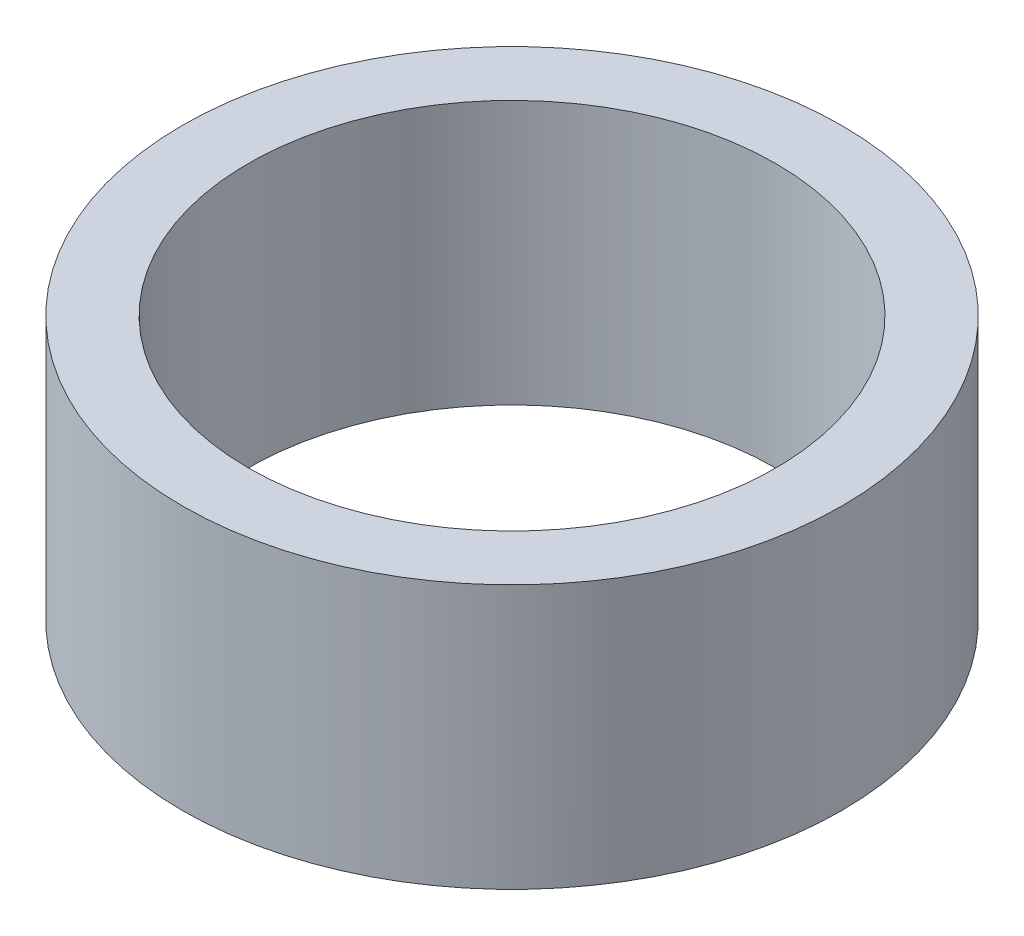
ISO-10303-21;
HEADER;
FILE_DESCRIPTION(('STEP AP214'),'2;1');
FILE_NAME('part.step','',(''),(''),'','','');
FILE_SCHEMA(('AUTOMOTIVE_DESIGN { 1 0 10303 214 1 1 1 1 }'));
ENDSEC;
DATA;
#1=APPLICATION_CONTEXT('core data for automotive mechanical design processes');
#2=APPLICATION_PROTOCOL_DEFINITION('international standard','automotive_design',2000,#1);
#3=PRODUCT_CONTEXT('',#1,'mechanical');
#4=PRODUCT('Part','Part','',(#3));
#5=PRODUCT_RELATED_PRODUCT_CATEGORY('part','',(#4));
#6=PRODUCT_DEFINITION_FORMATION('','',#4);
#7=PRODUCT_DEFINITION_CONTEXT('part definition',#1,'design');
#8=PRODUCT_DEFINITION('design','',#6,#7);
#9=PRODUCT_DEFINITION_SHAPE('','',#8);
#10=(LENGTH_UNIT() NAMED_UNIT(*) SI_UNIT(.MILLI.,.METRE.));
#11=(NAMED_UNIT(*) PLANE_ANGLE_UNIT() SI_UNIT($,.RADIAN.));
#12=(NAMED_UNIT(*) SI_UNIT($,.STERADIAN.) SOLID_ANGLE_UNIT());
#13=UNCERTAINTY_MEASURE_WITH_UNIT(LENGTH_MEASURE(1.E-05),#10,'distance_accuracy_value','');
#14=(GEOMETRIC_REPRESENTATION_CONTEXT(3) GLOBAL_UNCERTAINTY_ASSIGNED_CONTEXT((#13)) GLOBAL_UNIT_ASSIGNED_CONTEXT((#10,
#11,#12)) REPRESENTATION_CONTEXT('',''));
#15=CARTESIAN_POINT('',(0.,0.,0.));
#16=DIRECTION('',(0.,0.,1.));
#17=DIRECTION('',(1.,0.,0.));
#18=AXIS2_PLACEMENT_3D('',#15,#16,#17);
#19=CARTESIAN_POINT('',(2143.78269268001,591.547942348001,668.994154800002));
#20=DIRECTION('',(0.00012941094163007,0.999999972257219,-0.000196820653176026));
#21=DIRECTION('',(0.,0.000196820654824122,0.999999980630815));
#22=AXIS2_PLACEMENT_3D('',#19,#20,#21);
#23=CYLINDRICAL_SURFACE('',#22,4.99999999999984);
#24=CARTESIAN_POINT('',(2143.78269268001,591.547942348001,668.994154800002));
#25=DIRECTION('',(0.00012941094163007,0.999999972257219,-0.000196820653176026));
#26=DIRECTION('',(0.,-0.000196820654824123,-0.999999980630815));
#27=AXIS2_PLACEMENT_3D('',#24,#25,#26);
#28=CIRCLE('',#27,4.99999999999984);
#29=CARTESIAN_POINT('',(2143.78269268001,591.546958244727,663.994154896848));
#30=VERTEX_POINT('',#29);
#31=EDGE_CURVE('E10',#30,#30,#28,.T.);
#32=ORIENTED_EDGE('',*,*,#31,.T.);
#33=EDGE_LOOP('',(#32));
#34=FACE_BOUND('',#33,.T.);
#35=CARTESIAN_POINT('',(2143.78321032378,595.547942236999,668.993367517389));
#36=DIRECTION('',(0.00012941094163007,0.999999972257219,-0.000196820653176026));
#37=DIRECTION('',(0.,-0.000196820654824123,-0.999999980630815));
#38=AXIS2_PLACEMENT_3D('',#35,#36,#37);
#39=CIRCLE('',#38,4.99999999999984);
#40=CARTESIAN_POINT('',(2143.78321032378,595.546958133725,663.993367614235));
#41=VERTEX_POINT('',#40);
#42=EDGE_CURVE('E37',#41,#41,#39,.T.);
#43=ORIENTED_EDGE('',*,*,#42,.F.);
#44=EDGE_LOOP('',(#43));
#45=FACE_BOUND('',#44,.T.);
#46=ADVANCED_FACE('F31',(#34,#45),#23,.T.);
#47=CARTESIAN_POINT('',(2143.78269268001,591.547942348001,668.994154800002));
#48=DIRECTION('',(-0.00012941094163007,-0.999999972257219,0.000196820653176026));
#49=DIRECTION('',(0.,-0.000196820654824123,-0.999999980630815));
#50=AXIS2_PLACEMENT_3D('',#47,#48,#49);
#51=PLANE('',#50);
#52=CARTESIAN_POINT('',(2143.78269268001,591.547942348001,668.994154800002));
#53=DIRECTION('',(0.00012941094163007,0.999999972257219,-0.000196820653176026));
#54=DIRECTION('',(0.,-0.000196820654824123,-0.999999980630815));
#55=AXIS2_PLACEMENT_3D('',#52,#53,#54);
#56=CIRCLE('',#55,3.99999999999983);
#57=CARTESIAN_POINT('',(2143.78269268001,591.547155065382,664.994154877479));
#58=VERTEX_POINT('',#57);
#59=EDGE_CURVE('E41',#58,#58,#56,.T.);
#60=ORIENTED_EDGE('',*,*,#59,.T.);
#61=EDGE_LOOP('',(#60));
#62=FACE_BOUND('',#61,.T.);
#63=ORIENTED_EDGE('',*,*,#31,.F.);
#64=EDGE_LOOP('',(#63));
#65=FACE_BOUND('',#64,.T.);
#66=ADVANCED_FACE('F55',(#62,#65),#51,.T.);
#67=CARTESIAN_POINT('',(2143.78321032378,595.547942236999,668.993367517389));
#68=DIRECTION('',(-0.00012941094163007,-0.999999972257219,0.000196820653176026));
#69=DIRECTION('',(0.,-0.000196820654824123,-0.999999980630815));
#70=AXIS2_PLACEMENT_3D('',#67,#68,#69);
#71=PLANE('',#70);
#72=CARTESIAN_POINT('',(2143.78321032378,595.547942236999,668.993367517389));
#73=DIRECTION('',(0.00012941094163007,0.999999972257219,-0.000196820653176026));
#74=DIRECTION('',(0.,-0.000196820654824123,-0.999999980630815));
#75=AXIS2_PLACEMENT_3D('',#72,#73,#74);
#76=CIRCLE('',#75,3.99999999999983);
#77=CARTESIAN_POINT('',(2143.78321032378,595.54715495438,664.993367594866));
#78=VERTEX_POINT('',#77);
#79=EDGE_CURVE('E45',#78,#78,#76,.T.);
#80=ORIENTED_EDGE('',*,*,#79,.F.);
#81=EDGE_LOOP('',(#80));
#82=FACE_BOUND('',#81,.T.);
#83=ORIENTED_EDGE('',*,*,#42,.T.);
#84=EDGE_LOOP('',(#83));
#85=FACE_BOUND('',#84,.T.);
#86=ADVANCED_FACE('F53',(#82,#85),#71,.F.);
#87=CARTESIAN_POINT('',(2143.78269268001,591.547942348001,668.994154800002));
#88=DIRECTION('',(0.00012941094163007,0.999999972257219,-0.000196820653176026));
#89=DIRECTION('',(0.,0.000196820654824122,0.999999980630815));
#90=AXIS2_PLACEMENT_3D('',#87,#88,#89);
#91=CYLINDRICAL_SURFACE('',#90,3.99999999999983);
#92=ORIENTED_EDGE('',*,*,#59,.F.);
#93=EDGE_LOOP('',(#92));
#94=FACE_BOUND('',#93,.T.);
#95=ORIENTED_EDGE('',*,*,#79,.T.);
#96=EDGE_LOOP('',(#95));
#97=FACE_BOUND('',#96,.T.);
#98=ADVANCED_FACE('F51',(#94,#97),#91,.F.);
#99=CLOSED_SHELL('',(#46,#66,#86,#98));
#100=MANIFOLD_SOLID_BREP('B2',#99);
#101=ADVANCED_BREP_SHAPE_REPRESENTATION('',(#18,#100),#14);
#102=SHAPE_DEFINITION_REPRESENTATION(#9,#101);
ENDSEC;
END-ISO-10303-21;
